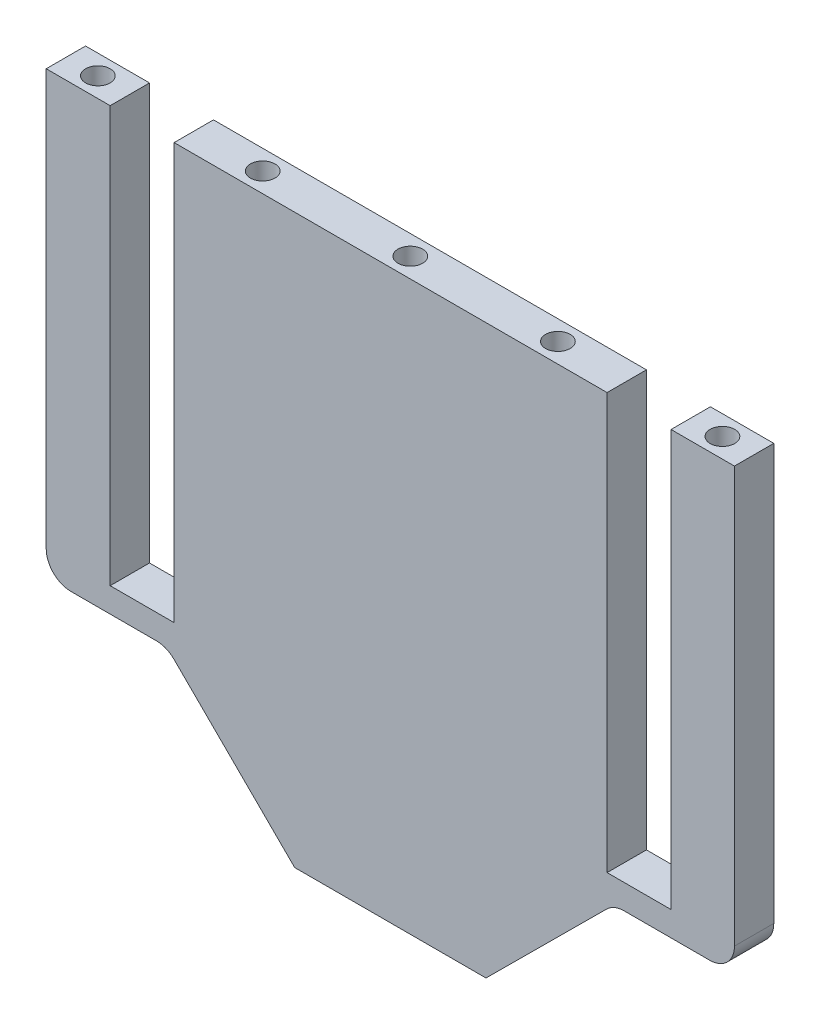
ISO-10303-21;
HEADER;
FILE_DESCRIPTION(('STEP AP214'),'2;1');
FILE_NAME('part.step','',(''),(''),'','','');
FILE_SCHEMA(('AUTOMOTIVE_DESIGN { 1 0 10303 214 1 1 1 1 }'));
ENDSEC;
DATA;
#1=APPLICATION_CONTEXT('core data for automotive mechanical design processes');
#2=APPLICATION_PROTOCOL_DEFINITION('international standard','automotive_design',2000,#1);
#3=PRODUCT_CONTEXT('',#1,'mechanical');
#4=PRODUCT('Part','Part','',(#3));
#5=PRODUCT_RELATED_PRODUCT_CATEGORY('part','',(#4));
#6=PRODUCT_DEFINITION_FORMATION('','',#4);
#7=PRODUCT_DEFINITION_CONTEXT('part definition',#1,'design');
#8=PRODUCT_DEFINITION('design','',#6,#7);
#9=PRODUCT_DEFINITION_SHAPE('','',#8);
#10=(LENGTH_UNIT() NAMED_UNIT(*) SI_UNIT(.MILLI.,.METRE.));
#11=(NAMED_UNIT(*) PLANE_ANGLE_UNIT() SI_UNIT($,.RADIAN.));
#12=(NAMED_UNIT(*) SI_UNIT($,.STERADIAN.) SOLID_ANGLE_UNIT());
#13=UNCERTAINTY_MEASURE_WITH_UNIT(LENGTH_MEASURE(1.E-05),#10,'distance_accuracy_value','');
#14=(GEOMETRIC_REPRESENTATION_CONTEXT(3) GLOBAL_UNCERTAINTY_ASSIGNED_CONTEXT((#13)) GLOBAL_UNIT_ASSIGNED_CONTEXT((#10,
#11,#12)) REPRESENTATION_CONTEXT('',''));
#15=CARTESIAN_POINT('',(0.,0.,0.));
#16=DIRECTION('',(0.,0.,1.));
#17=DIRECTION('',(1.,0.,0.));
#18=AXIS2_PLACEMENT_3D('',#15,#16,#17);
#19=CARTESIAN_POINT('',(0.,115.359943174136,8.01));
#20=DIRECTION('',(0.,1.,0.));
#21=DIRECTION('',(0.,0.,1.));
#22=AXIS2_PLACEMENT_3D('',#19,#20,#21);
#23=PLANE('',#22);
#24=CARTESIAN_POINT('',(6.49999999999998,115.359943174136,4.));
#25=DIRECTION('',(0.,-1.,0.));
#26=DIRECTION('',(0.,0.,-1.));
#27=AXIS2_PLACEMENT_3D('',#24,#25,#26);
#28=CIRCLE('',#27,2.5);
#29=CARTESIAN_POINT('',(6.49999999999998,115.359943174136,1.50000000000001));
#30=VERTEX_POINT('',#29);
#31=EDGE_CURVE('E387',#30,#30,#28,.T.);
#32=ORIENTED_EDGE('',*,*,#31,.T.);
#33=EDGE_LOOP('',(#32));
#34=FACE_BOUND('',#33,.T.);
#35=DIRECTION('',(0.,0.,1.));
#36=VECTOR('',#35,1.);
#37=CARTESIAN_POINT('',(0.,115.359943174136,8.));
#38=LINE('',#37,#36);
#39=CARTESIAN_POINT('',(0.,115.359943174136,0.));
#40=VERTEX_POINT('',#39);
#41=CARTESIAN_POINT('',(0.,115.359943174136,8.));
#42=VERTEX_POINT('',#41);
#43=EDGE_CURVE('E189',#40,#42,#38,.T.);
#44=ORIENTED_EDGE('',*,*,#43,.T.);
#45=DIRECTION('',(1.,0.,0.));
#46=VECTOR('',#45,1.);
#47=CARTESIAN_POINT('',(22.4368378443237,115.359943174136,8.));
#48=LINE('',#47,#46);
#49=CARTESIAN_POINT('',(13.,115.359943174136,8.));
#50=VERTEX_POINT('',#49);
#51=EDGE_CURVE('E192',#42,#50,#48,.T.);
#52=ORIENTED_EDGE('',*,*,#51,.T.);
#53=DIRECTION('',(0.,0.,1.));
#54=VECTOR('',#53,1.);
#55=CARTESIAN_POINT('',(13.,115.359943174136,8.));
#56=LINE('',#55,#54);
#57=CARTESIAN_POINT('',(13.,115.359943174136,0.));
#58=VERTEX_POINT('',#57);
#59=EDGE_CURVE('E190',#58,#50,#56,.T.);
#60=ORIENTED_EDGE('',*,*,#59,.F.);
#61=DIRECTION('',(1.,0.,0.));
#62=VECTOR('',#61,1.);
#63=CARTESIAN_POINT('',(22.4368378443237,115.359943174136,0.));
#64=LINE('',#63,#62);
#65=EDGE_CURVE('E176',#40,#58,#64,.T.);
#66=ORIENTED_EDGE('',*,*,#65,.F.);
#67=EDGE_LOOP('',(#44,#52,#60,#66));
#68=FACE_BOUND('',#67,.T.);
#69=ADVANCED_FACE('F40',(#34,#68),#23,.T.);
#70=CARTESIAN_POINT('',(133.441429644931,115.359943174136,4.));
#71=DIRECTION('',(0.,-1.,0.));
#72=DIRECTION('',(0.,0.,-1.));
#73=AXIS2_PLACEMENT_3D('',#70,#71,#72);
#74=CIRCLE('',#73,2.5);
#75=CARTESIAN_POINT('',(133.441429644931,115.359943174136,1.50000000000001));
#76=VERTEX_POINT('',#75);
#77=EDGE_CURVE('E205',#76,#76,#74,.T.);
#78=ORIENTED_EDGE('',*,*,#77,.T.);
#79=EDGE_LOOP('',(#78));
#80=FACE_BOUND('',#79,.T.);
#81=DIRECTION('',(0.,0.,-1.));
#82=VECTOR('',#81,1.);
#83=CARTESIAN_POINT('',(127.,115.359943174136,8.));
#84=LINE('',#83,#82);
#85=CARTESIAN_POINT('',(127.,115.359943174136,8.));
#86=VERTEX_POINT('',#85);
#87=CARTESIAN_POINT('',(127.,115.359943174136,0.));
#88=VERTEX_POINT('',#87);
#89=EDGE_CURVE('E245',#86,#88,#84,.T.);
#90=ORIENTED_EDGE('',*,*,#89,.F.);
#91=CARTESIAN_POINT('',(139.882859289862,115.359943174136,8.));
#92=VERTEX_POINT('',#91);
#93=EDGE_CURVE('E202',#86,#92,#48,.T.);
#94=ORIENTED_EDGE('',*,*,#93,.T.);
#95=DIRECTION('',(0.,0.,-1.));
#96=VECTOR('',#95,1.);
#97=CARTESIAN_POINT('',(139.882859289862,115.359943174136,8.));
#98=LINE('',#97,#96);
#99=CARTESIAN_POINT('',(139.882859289862,115.359943174136,0.));
#100=VERTEX_POINT('',#99);
#101=EDGE_CURVE('E198',#92,#100,#98,.T.);
#102=ORIENTED_EDGE('',*,*,#101,.T.);
#103=EDGE_CURVE('E194',#88,#100,#64,.T.);
#104=ORIENTED_EDGE('',*,*,#103,.F.);
#105=EDGE_LOOP('',(#90,#94,#102,#104));
#106=FACE_BOUND('',#105,.T.);
#107=ADVANCED_FACE('F299',(#80,#106),#23,.T.);
#108=CARTESIAN_POINT('',(70.,115.359943174136,4.));
#109=DIRECTION('',(0.,-1.,0.));
#110=DIRECTION('',(0.,0.,-1.));
#111=AXIS2_PLACEMENT_3D('',#108,#109,#110);
#112=CIRCLE('',#111,2.5);
#113=CARTESIAN_POINT('',(70.,115.359943174136,1.50000000000001));
#114=VERTEX_POINT('',#113);
#115=EDGE_CURVE('E405',#114,#114,#112,.T.);
#116=ORIENTED_EDGE('',*,*,#115,.T.);
#117=EDGE_LOOP('',(#116));
#118=FACE_BOUND('',#117,.T.);
#119=CARTESIAN_POINT('',(100.,115.359943174136,4.));
#120=DIRECTION('',(0.,-1.,0.));
#121=DIRECTION('',(0.,0.,-1.));
#122=AXIS2_PLACEMENT_3D('',#119,#120,#121);
#123=CIRCLE('',#122,2.5);
#124=CARTESIAN_POINT('',(100.,115.359943174136,1.50000000000001));
#125=VERTEX_POINT('',#124);
#126=EDGE_CURVE('E399',#125,#125,#123,.T.);
#127=ORIENTED_EDGE('',*,*,#126,.T.);
#128=EDGE_LOOP('',(#127));
#129=FACE_BOUND('',#128,.T.);
#130=CARTESIAN_POINT('',(40.,115.359943174136,4.));
#131=DIRECTION('',(0.,-1.,0.));
#132=DIRECTION('',(0.,0.,-1.));
#133=AXIS2_PLACEMENT_3D('',#130,#131,#132);
#134=CIRCLE('',#133,2.5);
#135=CARTESIAN_POINT('',(40.,115.359943174136,1.50000000000001));
#136=VERTEX_POINT('',#135);
#137=EDGE_CURVE('E393',#136,#136,#134,.T.);
#138=ORIENTED_EDGE('',*,*,#137,.T.);
#139=EDGE_LOOP('',(#138));
#140=FACE_BOUND('',#139,.T.);
#141=DIRECTION('',(0.,0.,-1.));
#142=VECTOR('',#141,1.);
#143=CARTESIAN_POINT('',(26.,115.359943174136,8.));
#144=LINE('',#143,#142);
#145=CARTESIAN_POINT('',(26.,115.359943174136,8.));
#146=VERTEX_POINT('',#145);
#147=CARTESIAN_POINT('',(26.,115.359943174136,0.));
#148=VERTEX_POINT('',#147);
#149=EDGE_CURVE('E248',#146,#148,#144,.T.);
#150=ORIENTED_EDGE('',*,*,#149,.F.);
#151=CARTESIAN_POINT('',(114.,115.359943174136,8.));
#152=VERTEX_POINT('',#151);
#153=EDGE_CURVE('E251',#146,#152,#48,.T.);
#154=ORIENTED_EDGE('',*,*,#153,.T.);
#155=DIRECTION('',(0.,0.,1.));
#156=VECTOR('',#155,1.);
#157=CARTESIAN_POINT('',(114.,115.359943174136,8.));
#158=LINE('',#157,#156);
#159=CARTESIAN_POINT('',(114.,115.359943174136,0.));
#160=VERTEX_POINT('',#159);
#161=EDGE_CURVE('E242',#160,#152,#158,.T.);
#162=ORIENTED_EDGE('',*,*,#161,.F.);
#163=EDGE_CURVE('E191',#148,#160,#64,.T.);
#164=ORIENTED_EDGE('',*,*,#163,.F.);
#165=EDGE_LOOP('',(#150,#154,#162,#164));
#166=FACE_BOUND('',#165,.T.);
#167=ADVANCED_FACE('F430',(#118,#129,#140,#166),#23,.T.);
#168=CARTESIAN_POINT('',(5.00000000000006,25.8599431741363,8.));
#169=DIRECTION('',(0.,1.,0.));
#170=DIRECTION('',(0.,0.,1.));
#171=AXIS2_PLACEMENT_3D('',#168,#169,#170);
#172=PLANE('',#171);
#173=DIRECTION('',(1.,0.,0.));
#174=VECTOR('',#173,1.);
#175=CARTESIAN_POINT('',(5.00000000000006,25.8599431741363,0.));
#176=LINE('',#175,#174);
#177=CARTESIAN_POINT('',(5.00000000000006,25.8599431741363,0.));
#178=VERTEX_POINT('',#177);
#179=CARTESIAN_POINT('',(22.4368378443237,25.8599431741363,0.));
#180=VERTEX_POINT('',#179);
#181=EDGE_CURVE('E343',#178,#180,#176,.T.);
#182=ORIENTED_EDGE('',*,*,#181,.T.);
#183=DIRECTION('',(0.,0.,-1.));
#184=VECTOR('',#183,1.);
#185=CARTESIAN_POINT('',(22.4368378443237,25.8599431741363,8.));
#186=LINE('',#185,#184);
#187=CARTESIAN_POINT('',(22.4368378443237,25.8599431741363,8.));
#188=VERTEX_POINT('',#187);
#189=EDGE_CURVE('E359',#188,#180,#186,.T.);
#190=ORIENTED_EDGE('',*,*,#189,.F.);
#191=DIRECTION('',(1.,0.,0.));
#192=VECTOR('',#191,1.);
#193=CARTESIAN_POINT('',(5.00000000000006,25.8599431741363,8.));
#194=LINE('',#193,#192);
#195=CARTESIAN_POINT('',(5.00000000000006,25.8599431741363,8.));
#196=VERTEX_POINT('',#195);
#197=EDGE_CURVE('E322',#196,#188,#194,.T.);
#198=ORIENTED_EDGE('',*,*,#197,.F.);
#199=DIRECTION('',(0.,0.,-1.));
#200=VECTOR('',#199,1.);
#201=CARTESIAN_POINT('',(5.00000000000006,25.8599431741363,8.));
#202=LINE('',#201,#200);
#203=EDGE_CURVE('E355',#196,#178,#202,.T.);
#204=ORIENTED_EDGE('',*,*,#203,.T.);
#205=EDGE_LOOP('',(#182,#190,#198,#204));
#206=FACE_BOUND('',#205,.T.);
#207=ADVANCED_FACE('F358',(#206),#172,.F.);
#208=CARTESIAN_POINT('',(22.4368378443237,20.8599431741363,8.));
#209=DIRECTION('',(0.,0.,-1.));
#210=DIRECTION('',(-1.,0.,0.));
#211=AXIS2_PLACEMENT_3D('',#208,#209,#210);
#212=CYLINDRICAL_SURFACE('',#211,5.);
#213=CARTESIAN_POINT('',(22.4368378443237,20.8599431741363,0.));
#214=DIRECTION('',(0.,0.,-1.));
#215=DIRECTION('',(-1.,0.,0.));
#216=AXIS2_PLACEMENT_3D('',#213,#214,#215);
#217=CIRCLE('',#216,5.);
#218=CARTESIAN_POINT('',(25.9628105654398,24.4050124781055,0.));
#219=VERTEX_POINT('',#218);
#220=EDGE_CURVE('E336',#180,#219,#217,.T.);
#221=ORIENTED_EDGE('',*,*,#220,.T.);
#222=DIRECTION('',(0.,0.,-1.));
#223=VECTOR('',#222,1.);
#224=CARTESIAN_POINT('',(25.9628105654398,24.4050124781055,8.));
#225=LINE('',#224,#223);
#226=CARTESIAN_POINT('',(25.9628105654398,24.4050124781055,8.));
#227=VERTEX_POINT('',#226);
#228=EDGE_CURVE('E367',#227,#219,#225,.T.);
#229=ORIENTED_EDGE('',*,*,#228,.F.);
#230=CARTESIAN_POINT('',(22.4368378443237,20.8599431741363,8.));
#231=DIRECTION('',(0.,0.,-1.));
#232=DIRECTION('',(-1.,0.,0.));
#233=AXIS2_PLACEMENT_3D('',#230,#231,#232);
#234=CIRCLE('',#233,5.);
#235=EDGE_CURVE('E319',#188,#227,#234,.T.);
#236=ORIENTED_EDGE('',*,*,#235,.F.);
#237=ORIENTED_EDGE('',*,*,#189,.T.);
#238=EDGE_LOOP('',(#221,#229,#236,#237));
#239=FACE_BOUND('',#238,.T.);
#240=ADVANCED_FACE('F365',(#239),#212,.F.);
#241=CARTESIAN_POINT('',(25.9628105654398,24.4050124781055,8.));
#242=DIRECTION('',(0.705194544223226,0.709013860793847,0.));
#243=DIRECTION('',(-0.709013860793847,0.705194544223226,0.));
#244=AXIS2_PLACEMENT_3D('',#241,#242,#243);
#245=PLANE('',#244);
#246=DIRECTION('',(0.709013860793847,-0.705194544223226,0.));
#247=VECTOR('',#246,1.);
#248=CARTESIAN_POINT('',(25.9628105654398,24.4050124781055,0.));
#249=LINE('',#248,#247);
#250=CARTESIAN_POINT('',(50.5,0.,0.));
#251=VERTEX_POINT('',#250);
#252=EDGE_CURVE('E333',#219,#251,#249,.T.);
#253=ORIENTED_EDGE('',*,*,#252,.T.);
#254=DIRECTION('',(0.,0.,-1.));
#255=VECTOR('',#254,1.);
#256=CARTESIAN_POINT('',(50.5,0.,8.));
#257=LINE('',#256,#255);
#258=CARTESIAN_POINT('',(50.5,0.,8.));
#259=VERTEX_POINT('',#258);
#260=EDGE_CURVE('E320',#259,#251,#257,.T.);
#261=ORIENTED_EDGE('',*,*,#260,.F.);
#262=DIRECTION('',(0.709013860793847,-0.705194544223226,0.));
#263=VECTOR('',#262,1.);
#264=CARTESIAN_POINT('',(25.9628105654398,24.4050124781055,8.));
#265=LINE('',#264,#263);
#266=EDGE_CURVE('E317',#227,#259,#265,.T.);
#267=ORIENTED_EDGE('',*,*,#266,.F.);
#268=ORIENTED_EDGE('',*,*,#228,.T.);
#269=EDGE_LOOP('',(#253,#261,#267,#268));
#270=FACE_BOUND('',#269,.T.);
#271=ADVANCED_FACE('F369',(#270),#245,.F.);
#272=CARTESIAN_POINT('',(89.3828592898621,0.,8.));
#273=DIRECTION('',(0.,1.,0.));
#274=DIRECTION('',(0.,0.,1.));
#275=AXIS2_PLACEMENT_3D('',#272,#273,#274);
#276=PLANE('',#275);
#277=DIRECTION('',(1.,0.,0.));
#278=VECTOR('',#277,1.);
#279=CARTESIAN_POINT('',(89.3828592898621,0.,0.));
#280=LINE('',#279,#278);
#281=CARTESIAN_POINT('',(89.3828592898621,0.,0.));
#282=VERTEX_POINT('',#281);
#283=EDGE_CURVE('E273',#251,#282,#280,.T.);
#284=ORIENTED_EDGE('',*,*,#283,.T.);
#285=DIRECTION('',(0.,0.,-1.));
#286=VECTOR('',#285,1.);
#287=CARTESIAN_POINT('',(89.3828592898621,0.,8.));
#288=LINE('',#287,#286);
#289=CARTESIAN_POINT('',(89.3828592898621,0.,8.));
#290=VERTEX_POINT('',#289);
#291=EDGE_CURVE('E244',#290,#282,#288,.T.);
#292=ORIENTED_EDGE('',*,*,#291,.F.);
#293=DIRECTION('',(1.,0.,0.));
#294=VECTOR('',#293,1.);
#295=CARTESIAN_POINT('',(89.3828592898621,0.,8.));
#296=LINE('',#295,#294);
#297=EDGE_CURVE('E331',#259,#290,#296,.T.);
#298=ORIENTED_EDGE('',*,*,#297,.F.);
#299=ORIENTED_EDGE('',*,*,#260,.T.);
#300=EDGE_LOOP('',(#284,#292,#298,#299));
#301=FACE_BOUND('',#300,.T.);
#302=ADVANCED_FACE('F444',(#301),#276,.F.);
#303=CARTESIAN_POINT('',(113.920048724422,24.4050124781055,8.));
#304=DIRECTION('',(-0.705194544223226,0.709013860793847,0.));
#305=DIRECTION('',(-0.709013860793847,-0.705194544223226,0.));
#306=AXIS2_PLACEMENT_3D('',#303,#304,#305);
#307=PLANE('',#306);
#308=DIRECTION('',(0.709013860793847,0.705194544223226,0.));
#309=VECTOR('',#308,1.);
#310=CARTESIAN_POINT('',(113.920048724422,24.4050124781055,0.));
#311=LINE('',#310,#309);
#312=CARTESIAN_POINT('',(113.920048724422,24.4050124781055,0.));
#313=VERTEX_POINT('',#312);
#314=EDGE_CURVE('E313',#282,#313,#311,.T.);
#315=ORIENTED_EDGE('',*,*,#314,.T.);
#316=DIRECTION('',(0.,0.,-1.));
#317=VECTOR('',#316,1.);
#318=CARTESIAN_POINT('',(113.920048724422,24.4050124781055,8.));
#319=LINE('',#318,#317);
#320=CARTESIAN_POINT('',(113.920048724422,24.4050124781055,8.));
#321=VERTEX_POINT('',#320);
#322=EDGE_CURVE('E379',#321,#313,#319,.T.);
#323=ORIENTED_EDGE('',*,*,#322,.F.);
#324=DIRECTION('',(0.709013860793847,0.705194544223226,0.));
#325=VECTOR('',#324,1.);
#326=CARTESIAN_POINT('',(113.920048724422,24.4050124781055,8.));
#327=LINE('',#326,#325);
#328=EDGE_CURVE('E330',#290,#321,#327,.T.);
#329=ORIENTED_EDGE('',*,*,#328,.F.);
#330=ORIENTED_EDGE('',*,*,#291,.T.);
#331=EDGE_LOOP('',(#315,#323,#329,#330));
#332=FACE_BOUND('',#331,.T.);
#333=ADVANCED_FACE('F516',(#332),#307,.F.);
#334=CARTESIAN_POINT('',(117.446021445538,20.8599431741363,8.));
#335=DIRECTION('',(0.,0.,-1.));
#336=DIRECTION('',(-1.,0.,0.));
#337=AXIS2_PLACEMENT_3D('',#334,#335,#336);
#338=CYLINDRICAL_SURFACE('',#337,5.);
#339=CARTESIAN_POINT('',(117.446021445538,20.8599431741363,0.));
#340=DIRECTION('',(0.,0.,-1.));
#341=DIRECTION('',(1.,0.,0.));
#342=AXIS2_PLACEMENT_3D('',#339,#340,#341);
#343=CIRCLE('',#342,5.);
#344=CARTESIAN_POINT('',(117.446021445538,25.8599431741363,0.));
#345=VERTEX_POINT('',#344);
#346=EDGE_CURVE('E307',#313,#345,#343,.T.);
#347=ORIENTED_EDGE('',*,*,#346,.T.);
#348=DIRECTION('',(0.,0.,-1.));
#349=VECTOR('',#348,1.);
#350=CARTESIAN_POINT('',(117.446021445538,25.8599431741363,8.));
#351=LINE('',#350,#349);
#352=CARTESIAN_POINT('',(117.446021445538,25.8599431741363,8.));
#353=VERTEX_POINT('',#352);
#354=EDGE_CURVE('E376',#353,#345,#351,.T.);
#355=ORIENTED_EDGE('',*,*,#354,.F.);
#356=CARTESIAN_POINT('',(117.446021445538,20.8599431741363,8.));
#357=DIRECTION('',(0.,0.,-1.));
#358=DIRECTION('',(1.,0.,0.));
#359=AXIS2_PLACEMENT_3D('',#356,#357,#358);
#360=CIRCLE('',#359,5.);
#361=EDGE_CURVE('E328',#321,#353,#360,.T.);
#362=ORIENTED_EDGE('',*,*,#361,.F.);
#363=ORIENTED_EDGE('',*,*,#322,.T.);
#364=EDGE_LOOP('',(#347,#355,#362,#363));
#365=FACE_BOUND('',#364,.T.);
#366=ADVANCED_FACE('F508',(#365),#338,.F.);
#367=CARTESIAN_POINT('',(134.882859289862,25.8599431741363,8.));
#368=DIRECTION('',(0.,1.,0.));
#369=DIRECTION('',(0.,0.,1.));
#370=AXIS2_PLACEMENT_3D('',#367,#368,#369);
#371=PLANE('',#370);
#372=DIRECTION('',(1.,0.,0.));
#373=VECTOR('',#372,1.);
#374=CARTESIAN_POINT('',(134.882859289862,25.8599431741363,0.));
#375=LINE('',#374,#373);
#376=CARTESIAN_POINT('',(134.882859289862,25.8599431741363,0.));
#377=VERTEX_POINT('',#376);
#378=EDGE_CURVE('E303',#345,#377,#375,.T.);
#379=ORIENTED_EDGE('',*,*,#378,.T.);
#380=DIRECTION('',(0.,0.,-1.));
#381=VECTOR('',#380,1.);
#382=CARTESIAN_POINT('',(134.882859289862,25.8599431741363,8.));
#383=LINE('',#382,#381);
#384=CARTESIAN_POINT('',(134.882859289862,25.8599431741363,8.));
#385=VERTEX_POINT('',#384);
#386=EDGE_CURVE('E374',#385,#377,#383,.T.);
#387=ORIENTED_EDGE('',*,*,#386,.F.);
#388=DIRECTION('',(1.,0.,0.));
#389=VECTOR('',#388,1.);
#390=CARTESIAN_POINT('',(134.882859289862,25.8599431741363,8.));
#391=LINE('',#390,#389);
#392=EDGE_CURVE('E326',#353,#385,#391,.T.);
#393=ORIENTED_EDGE('',*,*,#392,.F.);
#394=ORIENTED_EDGE('',*,*,#354,.T.);
#395=EDGE_LOOP('',(#379,#387,#393,#394));
#396=FACE_BOUND('',#395,.T.);
#397=ADVANCED_FACE('F502',(#396),#371,.F.);
#398=CARTESIAN_POINT('',(134.882859289862,30.8599431741363,8.));
#399=DIRECTION('',(0.,0.,-1.));
#400=DIRECTION('',(-1.,0.,0.));
#401=AXIS2_PLACEMENT_3D('',#398,#399,#400);
#402=CYLINDRICAL_SURFACE('',#401,5.);
#403=CARTESIAN_POINT('',(134.882859289862,30.8599431741363,0.));
#404=DIRECTION('',(0.,0.,1.));
#405=DIRECTION('',(1.,0.,0.));
#406=AXIS2_PLACEMENT_3D('',#403,#404,#405);
#407=CIRCLE('',#406,5.);
#408=CARTESIAN_POINT('',(139.882859289862,30.8599431741363,0.));
#409=VERTEX_POINT('',#408);
#410=EDGE_CURVE('E215',#377,#409,#407,.T.);
#411=ORIENTED_EDGE('',*,*,#410,.T.);
#412=DIRECTION('',(0.,0.,-1.));
#413=VECTOR('',#412,1.);
#414=CARTESIAN_POINT('',(139.882859289862,30.8599431741363,8.));
#415=LINE('',#414,#413);
#416=CARTESIAN_POINT('',(139.882859289862,30.8599431741363,8.));
#417=VERTEX_POINT('',#416);
#418=EDGE_CURVE('E296',#417,#409,#415,.T.);
#419=ORIENTED_EDGE('',*,*,#418,.F.);
#420=CARTESIAN_POINT('',(134.882859289862,30.8599431741363,8.));
#421=DIRECTION('',(0.,0.,1.));
#422=DIRECTION('',(1.,0.,0.));
#423=AXIS2_PLACEMENT_3D('',#420,#421,#422);
#424=CIRCLE('',#423,5.);
#425=EDGE_CURVE('E212',#385,#417,#424,.T.);
#426=ORIENTED_EDGE('',*,*,#425,.F.);
#427=ORIENTED_EDGE('',*,*,#386,.T.);
#428=EDGE_LOOP('',(#411,#419,#426,#427));
#429=FACE_BOUND('',#428,.T.);
#430=ADVANCED_FACE('F496',(#429),#402,.T.);
#431=CARTESIAN_POINT('',(5.00000000000002,30.8599431741363,8.));
#432=DIRECTION('',(0.,0.,-1.));
#433=DIRECTION('',(-1.,0.,0.));
#434=AXIS2_PLACEMENT_3D('',#431,#432,#433);
#435=CYLINDRICAL_SURFACE('',#434,5.);
#436=CARTESIAN_POINT('',(5.00000000000002,30.8599431741363,0.));
#437=DIRECTION('',(0.,0.,1.));
#438=DIRECTION('',(-1.,0.,0.));
#439=AXIS2_PLACEMENT_3D('',#436,#437,#438);
#440=CIRCLE('',#439,5.);
#441=CARTESIAN_POINT('',(0.,30.8599431741363,0.));
#442=VERTEX_POINT('',#441);
#443=EDGE_CURVE('E179',#442,#178,#440,.T.);
#444=ORIENTED_EDGE('',*,*,#443,.T.);
#445=ORIENTED_EDGE('',*,*,#203,.F.);
#446=CARTESIAN_POINT('',(5.00000000000002,30.8599431741363,8.));
#447=DIRECTION('',(0.,0.,1.));
#448=DIRECTION('',(-1.,0.,0.));
#449=AXIS2_PLACEMENT_3D('',#446,#447,#448);
#450=CIRCLE('',#449,5.);
#451=CARTESIAN_POINT('',(0.,30.8599431741363,8.));
#452=VERTEX_POINT('',#451);
#453=EDGE_CURVE('E211',#452,#196,#450,.T.);
#454=ORIENTED_EDGE('',*,*,#453,.F.);
#455=DIRECTION('',(0.,0.,-1.));
#456=VECTOR('',#455,1.);
#457=CARTESIAN_POINT('',(0.,30.8599431741363,8.));
#458=LINE('',#457,#456);
#459=EDGE_CURVE('E357',#452,#442,#458,.T.);
#460=ORIENTED_EDGE('',*,*,#459,.T.);
#461=EDGE_LOOP('',(#444,#445,#454,#460));
#462=FACE_BOUND('',#461,.T.);
#463=ADVANCED_FACE('F353',(#462),#435,.T.);
#464=CARTESIAN_POINT('',(13.,30.8599431741363,8.));
#465=DIRECTION('',(0.,1.,0.));
#466=DIRECTION('',(0.,0.,1.));
#467=AXIS2_PLACEMENT_3D('',#464,#465,#466);
#468=PLANE('',#467);
#469=DIRECTION('',(1.,0.,0.));
#470=VECTOR('',#469,1.);
#471=CARTESIAN_POINT('',(13.,30.8599431741363,0.));
#472=LINE('',#471,#470);
#473=CARTESIAN_POINT('',(13.,30.8599431741363,0.));
#474=VERTEX_POINT('',#473);
#475=CARTESIAN_POINT('',(26.,30.8599431741363,0.));
#476=VERTEX_POINT('',#475);
#477=EDGE_CURVE('E228',#474,#476,#472,.T.);
#478=ORIENTED_EDGE('',*,*,#477,.F.);
#479=DIRECTION('',(0.,0.,-1.));
#480=VECTOR('',#479,1.);
#481=CARTESIAN_POINT('',(13.,30.8599431741363,8.));
#482=LINE('',#481,#480);
#483=CARTESIAN_POINT('',(13.,30.8599431741363,8.));
#484=VERTEX_POINT('',#483);
#485=EDGE_CURVE('E219',#484,#474,#482,.T.);
#486=ORIENTED_EDGE('',*,*,#485,.F.);
#487=DIRECTION('',(1.,0.,0.));
#488=VECTOR('',#487,1.);
#489=CARTESIAN_POINT('',(13.,30.8599431741363,8.));
#490=LINE('',#489,#488);
#491=CARTESIAN_POINT('',(26.,30.8599431741363,8.));
#492=VERTEX_POINT('',#491);
#493=EDGE_CURVE('E222',#484,#492,#490,.T.);
#494=ORIENTED_EDGE('',*,*,#493,.T.);
#495=DIRECTION('',(0.,0.,-1.));
#496=VECTOR('',#495,1.);
#497=CARTESIAN_POINT('',(26.,30.8599431741363,8.));
#498=LINE('',#497,#496);
#499=EDGE_CURVE('E271',#492,#476,#498,.T.);
#500=ORIENTED_EDGE('',*,*,#499,.T.);
#501=EDGE_LOOP('',(#478,#486,#494,#500));
#502=FACE_BOUND('',#501,.T.);
#503=ADVANCED_FACE('F267',(#502),#468,.T.);
#504=CARTESIAN_POINT('',(127.,30.8599431741363,8.));
#505=DIRECTION('',(0.,1.,0.));
#506=DIRECTION('',(0.,0.,1.));
#507=AXIS2_PLACEMENT_3D('',#504,#505,#506);
#508=PLANE('',#507);
#509=DIRECTION('',(1.,0.,0.));
#510=VECTOR('',#509,1.);
#511=CARTESIAN_POINT('',(127.,30.8599431741363,0.));
#512=LINE('',#511,#510);
#513=CARTESIAN_POINT('',(114.,30.8599431741363,0.));
#514=VERTEX_POINT('',#513);
#515=CARTESIAN_POINT('',(127.,30.8599431741363,0.));
#516=VERTEX_POINT('',#515);
#517=EDGE_CURVE('E234',#514,#516,#512,.T.);
#518=ORIENTED_EDGE('',*,*,#517,.F.);
#519=DIRECTION('',(0.,0.,-1.));
#520=VECTOR('',#519,1.);
#521=CARTESIAN_POINT('',(114.,30.8599431741363,8.));
#522=LINE('',#521,#520);
#523=CARTESIAN_POINT('',(114.,30.8599431741363,8.));
#524=VERTEX_POINT('',#523);
#525=EDGE_CURVE('E278',#524,#514,#522,.T.);
#526=ORIENTED_EDGE('',*,*,#525,.F.);
#527=DIRECTION('',(1.,0.,0.));
#528=VECTOR('',#527,1.);
#529=CARTESIAN_POINT('',(127.,30.8599431741363,8.));
#530=LINE('',#529,#528);
#531=CARTESIAN_POINT('',(127.,30.8599431741363,8.));
#532=VERTEX_POINT('',#531);
#533=EDGE_CURVE('E232',#524,#532,#530,.T.);
#534=ORIENTED_EDGE('',*,*,#533,.T.);
#535=DIRECTION('',(0.,0.,-1.));
#536=VECTOR('',#535,1.);
#537=CARTESIAN_POINT('',(127.,30.8599431741363,8.));
#538=LINE('',#537,#536);
#539=EDGE_CURVE('E239',#532,#516,#538,.T.);
#540=ORIENTED_EDGE('',*,*,#539,.T.);
#541=EDGE_LOOP('',(#518,#526,#534,#540));
#542=FACE_BOUND('',#541,.T.);
#543=ADVANCED_FACE('F284',(#542),#508,.T.);
#544=CARTESIAN_POINT('',(22.4368378443237,20.8599431741363,8.));
#545=DIRECTION('',(0.,0.,-1.));
#546=DIRECTION('',(-1.,0.,0.));
#547=AXIS2_PLACEMENT_3D('',#544,#545,#546);
#548=PLANE('',#547);
#549=ORIENTED_EDGE('',*,*,#51,.F.);
#550=DIRECTION('',(0.,-1.,0.));
#551=VECTOR('',#550,1.);
#552=CARTESIAN_POINT('',(0.,30.8599431741363,8.));
#553=LINE('',#552,#551);
#554=EDGE_CURVE('E196',#42,#452,#553,.T.);
#555=ORIENTED_EDGE('',*,*,#554,.T.);
#556=ORIENTED_EDGE('',*,*,#453,.T.);
#557=ORIENTED_EDGE('',*,*,#197,.T.);
#558=ORIENTED_EDGE('',*,*,#235,.T.);
#559=ORIENTED_EDGE('',*,*,#266,.T.);
#560=ORIENTED_EDGE('',*,*,#297,.T.);
#561=ORIENTED_EDGE('',*,*,#328,.T.);
#562=ORIENTED_EDGE('',*,*,#361,.T.);
#563=ORIENTED_EDGE('',*,*,#392,.T.);
#564=ORIENTED_EDGE('',*,*,#425,.T.);
#565=DIRECTION('',(0.,1.,0.));
#566=VECTOR('',#565,1.);
#567=CARTESIAN_POINT('',(139.882859289862,30.8599431741363,8.));
#568=LINE('',#567,#566);
#569=EDGE_CURVE('E210',#417,#92,#568,.T.);
#570=ORIENTED_EDGE('',*,*,#569,.T.);
#571=ORIENTED_EDGE('',*,*,#93,.F.);
#572=DIRECTION('',(0.,1.,0.));
#573=VECTOR('',#572,1.);
#574=CARTESIAN_POINT('',(127.,219.008918922933,8.));
#575=LINE('',#574,#573);
#576=EDGE_CURVE('E231',#532,#86,#575,.T.);
#577=ORIENTED_EDGE('',*,*,#576,.F.);
#578=ORIENTED_EDGE('',*,*,#533,.F.);
#579=DIRECTION('',(0.,-1.,0.));
#580=VECTOR('',#579,1.);
#581=CARTESIAN_POINT('',(114.,30.8599431741363,8.));
#582=LINE('',#581,#580);
#583=EDGE_CURVE('E229',#152,#524,#582,.T.);
#584=ORIENTED_EDGE('',*,*,#583,.F.);
#585=ORIENTED_EDGE('',*,*,#153,.F.);
#586=DIRECTION('',(0.,1.,0.));
#587=VECTOR('',#586,1.);
#588=CARTESIAN_POINT('',(26.,30.8599431741363,8.));
#589=LINE('',#588,#587);
#590=EDGE_CURVE('E218',#492,#146,#589,.T.);
#591=ORIENTED_EDGE('',*,*,#590,.F.);
#592=ORIENTED_EDGE('',*,*,#493,.F.);
#593=DIRECTION('',(0.,-1.,0.));
#594=VECTOR('',#593,1.);
#595=CARTESIAN_POINT('',(13.,219.008918922933,8.));
#596=LINE('',#595,#594);
#597=EDGE_CURVE('E216',#50,#484,#596,.T.);
#598=ORIENTED_EDGE('',*,*,#597,.F.);
#599=EDGE_LOOP('',(#549,#555,#556,#557,#558,#559,#560,#561,#562,#563,#564,#570,#571,#577,#578,
#584,#585,#591,#592,#598));
#600=FACE_BOUND('',#599,.T.);
#601=ADVANCED_FACE('F259',(#600),#548,.F.);
#602=CARTESIAN_POINT('',(22.4368378443237,20.8599431741363,0.));
#603=DIRECTION('',(0.,0.,-1.));
#604=DIRECTION('',(-1.,0.,0.));
#605=AXIS2_PLACEMENT_3D('',#602,#603,#604);
#606=PLANE('',#605);
#607=DIRECTION('',(0.,-1.,0.));
#608=VECTOR('',#607,1.);
#609=CARTESIAN_POINT('',(0.,30.8599431741363,0.));
#610=LINE('',#609,#608);
#611=EDGE_CURVE('E173',#40,#442,#610,.T.);
#612=ORIENTED_EDGE('',*,*,#611,.F.);
#613=ORIENTED_EDGE('',*,*,#65,.T.);
#614=DIRECTION('',(0.,-1.,0.));
#615=VECTOR('',#614,1.);
#616=CARTESIAN_POINT('',(13.,219.008918922933,0.));
#617=LINE('',#616,#615);
#618=EDGE_CURVE('E223',#58,#474,#617,.T.);
#619=ORIENTED_EDGE('',*,*,#618,.T.);
#620=ORIENTED_EDGE('',*,*,#477,.T.);
#621=DIRECTION('',(0.,1.,0.));
#622=VECTOR('',#621,1.);
#623=CARTESIAN_POINT('',(26.,30.8599431741363,0.));
#624=LINE('',#623,#622);
#625=EDGE_CURVE('E225',#476,#148,#624,.T.);
#626=ORIENTED_EDGE('',*,*,#625,.T.);
#627=ORIENTED_EDGE('',*,*,#163,.T.);
#628=DIRECTION('',(0.,-1.,0.));
#629=VECTOR('',#628,1.);
#630=CARTESIAN_POINT('',(114.,30.8599431741363,0.));
#631=LINE('',#630,#629);
#632=EDGE_CURVE('E49',#160,#514,#631,.T.);
#633=ORIENTED_EDGE('',*,*,#632,.T.);
#634=ORIENTED_EDGE('',*,*,#517,.T.);
#635=DIRECTION('',(0.,1.,0.));
#636=VECTOR('',#635,1.);
#637=CARTESIAN_POINT('',(127.,219.008918922933,0.));
#638=LINE('',#637,#636);
#639=EDGE_CURVE('E11',#516,#88,#638,.T.);
#640=ORIENTED_EDGE('',*,*,#639,.T.);
#641=ORIENTED_EDGE('',*,*,#103,.T.);
#642=DIRECTION('',(0.,1.,0.));
#643=VECTOR('',#642,1.);
#644=CARTESIAN_POINT('',(139.882859289862,30.8599431741363,0.));
#645=LINE('',#644,#643);
#646=EDGE_CURVE('E184',#409,#100,#645,.T.);
#647=ORIENTED_EDGE('',*,*,#646,.F.);
#648=ORIENTED_EDGE('',*,*,#410,.F.);
#649=ORIENTED_EDGE('',*,*,#378,.F.);
#650=ORIENTED_EDGE('',*,*,#346,.F.);
#651=ORIENTED_EDGE('',*,*,#314,.F.);
#652=ORIENTED_EDGE('',*,*,#283,.F.);
#653=ORIENTED_EDGE('',*,*,#252,.F.);
#654=ORIENTED_EDGE('',*,*,#220,.F.);
#655=ORIENTED_EDGE('',*,*,#181,.F.);
#656=ORIENTED_EDGE('',*,*,#443,.F.);
#657=EDGE_LOOP('',(#612,#613,#619,#620,#626,#627,#633,#634,#640,#641,#647,#648,#649,#650,#651,
#652,#653,#654,#655,#656));
#658=FACE_BOUND('',#657,.T.);
#659=ADVANCED_FACE('F175',(#658),#606,.T.);
#660=CARTESIAN_POINT('',(114.,30.8599431741363,8.));
#661=DIRECTION('',(1.,0.,0.));
#662=DIRECTION('',(0.,0.,-1.));
#663=AXIS2_PLACEMENT_3D('',#660,#661,#662);
#664=PLANE('',#663);
#665=ORIENTED_EDGE('',*,*,#632,.F.);
#666=ORIENTED_EDGE('',*,*,#161,.T.);
#667=ORIENTED_EDGE('',*,*,#583,.T.);
#668=ORIENTED_EDGE('',*,*,#525,.T.);
#669=EDGE_LOOP('',(#665,#666,#667,#668));
#670=FACE_BOUND('',#669,.T.);
#671=ADVANCED_FACE('F42',(#670),#664,.T.);
#672=CARTESIAN_POINT('',(127.,219.008918922933,8.));
#673=DIRECTION('',(-1.,0.,0.));
#674=DIRECTION('',(0.,0.,1.));
#675=AXIS2_PLACEMENT_3D('',#672,#673,#674);
#676=PLANE('',#675);
#677=ORIENTED_EDGE('',*,*,#576,.T.);
#678=ORIENTED_EDGE('',*,*,#89,.T.);
#679=ORIENTED_EDGE('',*,*,#639,.F.);
#680=ORIENTED_EDGE('',*,*,#539,.F.);
#681=EDGE_LOOP('',(#677,#678,#679,#680));
#682=FACE_BOUND('',#681,.T.);
#683=ADVANCED_FACE('F288',(#682),#676,.T.);
#684=CARTESIAN_POINT('',(13.,219.008918922933,8.));
#685=DIRECTION('',(1.,0.,0.));
#686=DIRECTION('',(0.,0.,-1.));
#687=AXIS2_PLACEMENT_3D('',#684,#685,#686);
#688=PLANE('',#687);
#689=ORIENTED_EDGE('',*,*,#618,.F.);
#690=ORIENTED_EDGE('',*,*,#59,.T.);
#691=ORIENTED_EDGE('',*,*,#597,.T.);
#692=ORIENTED_EDGE('',*,*,#485,.T.);
#693=EDGE_LOOP('',(#689,#690,#691,#692));
#694=FACE_BOUND('',#693,.T.);
#695=ADVANCED_FACE('F264',(#694),#688,.T.);
#696=CARTESIAN_POINT('',(26.,30.8599431741363,8.));
#697=DIRECTION('',(-1.,0.,0.));
#698=DIRECTION('',(0.,0.,1.));
#699=AXIS2_PLACEMENT_3D('',#696,#697,#698);
#700=PLANE('',#699);
#701=ORIENTED_EDGE('',*,*,#590,.T.);
#702=ORIENTED_EDGE('',*,*,#149,.T.);
#703=ORIENTED_EDGE('',*,*,#625,.F.);
#704=ORIENTED_EDGE('',*,*,#499,.F.);
#705=EDGE_LOOP('',(#701,#702,#703,#704));
#706=FACE_BOUND('',#705,.T.);
#707=ADVANCED_FACE('F460',(#706),#700,.T.);
#708=CARTESIAN_POINT('',(0.,30.8599431741363,8.));
#709=DIRECTION('',(1.,0.,0.));
#710=DIRECTION('',(0.,1.,0.));
#711=AXIS2_PLACEMENT_3D('',#708,#709,#710);
#712=PLANE('',#711);
#713=ORIENTED_EDGE('',*,*,#43,.F.);
#714=ORIENTED_EDGE('',*,*,#611,.T.);
#715=ORIENTED_EDGE('',*,*,#459,.F.);
#716=ORIENTED_EDGE('',*,*,#554,.F.);
#717=EDGE_LOOP('',(#713,#714,#715,#716));
#718=FACE_BOUND('',#717,.T.);
#719=ADVANCED_FACE('F195',(#718),#712,.F.);
#720=CARTESIAN_POINT('',(139.882859289862,30.8599431741363,8.));
#721=DIRECTION('',(-1.,0.,0.));
#722=DIRECTION('',(0.,0.,1.));
#723=AXIS2_PLACEMENT_3D('',#720,#721,#722);
#724=PLANE('',#723);
#725=ORIENTED_EDGE('',*,*,#101,.F.);
#726=ORIENTED_EDGE('',*,*,#569,.F.);
#727=ORIENTED_EDGE('',*,*,#418,.T.);
#728=ORIENTED_EDGE('',*,*,#646,.T.);
#729=EDGE_LOOP('',(#725,#726,#727,#728));
#730=FACE_BOUND('',#729,.T.);
#731=ADVANCED_FACE('F295',(#730),#724,.F.);
#732=CARTESIAN_POINT('',(40.,110.159943174136,4.));
#733=DIRECTION('',(0.,1.,0.));
#734=DIRECTION('',(0.,0.,1.));
#735=AXIS2_PLACEMENT_3D('',#732,#733,#734);
#736=CYLINDRICAL_SURFACE('',#735,2.5);
#737=CARTESIAN_POINT('',(40.,110.159943174136,4.));
#738=DIRECTION('',(0.,-1.,0.));
#739=DIRECTION('',(0.,0.,-1.));
#740=AXIS2_PLACEMENT_3D('',#737,#738,#739);
#741=CIRCLE('',#740,2.5);
#742=CARTESIAN_POINT('',(40.,110.159943174136,1.50000000000001));
#743=VERTEX_POINT('',#742);
#744=EDGE_CURVE('E390',#743,#743,#741,.T.);
#745=ORIENTED_EDGE('',*,*,#744,.T.);
#746=EDGE_LOOP('',(#745));
#747=FACE_BOUND('',#746,.T.);
#748=ORIENTED_EDGE('',*,*,#137,.F.);
#749=EDGE_LOOP('',(#748));
#750=FACE_BOUND('',#749,.T.);
#751=ADVANCED_FACE('F457',(#747,#750),#736,.F.);
#752=CARTESIAN_POINT('',(40.,110.159943174136,4.));
#753=DIRECTION('',(0.,-1.,0.));
#754=DIRECTION('',(0.,0.,-1.));
#755=AXIS2_PLACEMENT_3D('',#752,#753,#754);
#756=PLANE('',#755);
#757=ORIENTED_EDGE('',*,*,#744,.F.);
#758=EDGE_LOOP('',(#757));
#759=FACE_BOUND('',#758,.T.);
#760=ADVANCED_FACE('F657',(#759),#756,.F.);
#761=CARTESIAN_POINT('',(100.,110.159943174136,4.));
#762=DIRECTION('',(0.,1.,0.));
#763=DIRECTION('',(0.,0.,1.));
#764=AXIS2_PLACEMENT_3D('',#761,#762,#763);
#765=CYLINDRICAL_SURFACE('',#764,2.5);
#766=CARTESIAN_POINT('',(100.,110.159943174136,4.));
#767=DIRECTION('',(0.,-1.,0.));
#768=DIRECTION('',(0.,0.,-1.));
#769=AXIS2_PLACEMENT_3D('',#766,#767,#768);
#770=CIRCLE('',#769,2.5);
#771=CARTESIAN_POINT('',(100.,110.159943174136,1.50000000000001));
#772=VERTEX_POINT('',#771);
#773=EDGE_CURVE('E396',#772,#772,#770,.T.);
#774=ORIENTED_EDGE('',*,*,#773,.T.);
#775=EDGE_LOOP('',(#774));
#776=FACE_BOUND('',#775,.T.);
#777=ORIENTED_EDGE('',*,*,#126,.F.);
#778=EDGE_LOOP('',(#777));
#779=FACE_BOUND('',#778,.T.);
#780=ADVANCED_FACE('F668',(#776,#779),#765,.F.);
#781=CARTESIAN_POINT('',(100.,110.159943174136,4.));
#782=DIRECTION('',(0.,-1.,0.));
#783=DIRECTION('',(0.,0.,-1.));
#784=AXIS2_PLACEMENT_3D('',#781,#782,#783);
#785=PLANE('',#784);
#786=ORIENTED_EDGE('',*,*,#773,.F.);
#787=EDGE_LOOP('',(#786));
#788=FACE_BOUND('',#787,.T.);
#789=ADVANCED_FACE('F679',(#788),#785,.F.);
#790=CARTESIAN_POINT('',(70.,110.159943174136,4.));
#791=DIRECTION('',(0.,1.,0.));
#792=DIRECTION('',(0.,0.,1.));
#793=AXIS2_PLACEMENT_3D('',#790,#791,#792);
#794=CYLINDRICAL_SURFACE('',#793,2.5);
#795=CARTESIAN_POINT('',(70.,110.159943174136,4.));
#796=DIRECTION('',(0.,-1.,0.));
#797=DIRECTION('',(0.,0.,-1.));
#798=AXIS2_PLACEMENT_3D('',#795,#796,#797);
#799=CIRCLE('',#798,2.5);
#800=CARTESIAN_POINT('',(70.,110.159943174136,1.50000000000001));
#801=VERTEX_POINT('',#800);
#802=EDGE_CURVE('E402',#801,#801,#799,.T.);
#803=ORIENTED_EDGE('',*,*,#802,.T.);
#804=EDGE_LOOP('',(#803));
#805=FACE_BOUND('',#804,.T.);
#806=ORIENTED_EDGE('',*,*,#115,.F.);
#807=EDGE_LOOP('',(#806));
#808=FACE_BOUND('',#807,.T.);
#809=ADVANCED_FACE('F425',(#805,#808),#794,.F.);
#810=CARTESIAN_POINT('',(70.,110.159943174136,4.));
#811=DIRECTION('',(0.,-1.,0.));
#812=DIRECTION('',(0.,0.,-1.));
#813=AXIS2_PLACEMENT_3D('',#810,#811,#812);
#814=PLANE('',#813);
#815=ORIENTED_EDGE('',*,*,#802,.F.);
#816=EDGE_LOOP('',(#815));
#817=FACE_BOUND('',#816,.T.);
#818=ADVANCED_FACE('F415',(#817),#814,.F.);
#819=CARTESIAN_POINT('',(133.441429644931,110.159943174136,4.));
#820=DIRECTION('',(0.,1.,0.));
#821=DIRECTION('',(0.,0.,1.));
#822=AXIS2_PLACEMENT_3D('',#819,#820,#821);
#823=CYLINDRICAL_SURFACE('',#822,2.5);
#824=CARTESIAN_POINT('',(133.441429644931,110.159943174136,4.));
#825=DIRECTION('',(0.,-1.,0.));
#826=DIRECTION('',(0.,0.,-1.));
#827=AXIS2_PLACEMENT_3D('',#824,#825,#826);
#828=CIRCLE('',#827,2.5);
#829=CARTESIAN_POINT('',(133.441429644931,110.159943174136,1.50000000000001));
#830=VERTEX_POINT('',#829);
#831=EDGE_CURVE('E199',#830,#830,#828,.T.);
#832=ORIENTED_EDGE('',*,*,#831,.T.);
#833=EDGE_LOOP('',(#832));
#834=FACE_BOUND('',#833,.T.);
#835=ORIENTED_EDGE('',*,*,#77,.F.);
#836=EDGE_LOOP('',(#835));
#837=FACE_BOUND('',#836,.T.);
#838=ADVANCED_FACE('F412',(#834,#837),#823,.F.);
#839=CARTESIAN_POINT('',(133.441429644931,110.159943174136,4.));
#840=DIRECTION('',(0.,-1.,0.));
#841=DIRECTION('',(0.,0.,-1.));
#842=AXIS2_PLACEMENT_3D('',#839,#840,#841);
#843=PLANE('',#842);
#844=ORIENTED_EDGE('',*,*,#831,.F.);
#845=EDGE_LOOP('',(#844));
#846=FACE_BOUND('',#845,.T.);
#847=ADVANCED_FACE('F414',(#846),#843,.F.);
#848=CARTESIAN_POINT('',(6.49999999999998,110.159943174136,4.));
#849=DIRECTION('',(0.,1.,0.));
#850=DIRECTION('',(0.,0.,1.));
#851=AXIS2_PLACEMENT_3D('',#848,#849,#850);
#852=CYLINDRICAL_SURFACE('',#851,2.5);
#853=CARTESIAN_POINT('',(6.49999999999998,110.159943174136,4.));
#854=DIRECTION('',(0.,-1.,0.));
#855=DIRECTION('',(0.,0.,-1.));
#856=AXIS2_PLACEMENT_3D('',#853,#854,#855);
#857=CIRCLE('',#856,2.5);
#858=CARTESIAN_POINT('',(6.49999999999998,110.159943174136,1.50000000000001));
#859=VERTEX_POINT('',#858);
#860=EDGE_CURVE('E384',#859,#859,#857,.T.);
#861=ORIENTED_EDGE('',*,*,#860,.T.);
#862=EDGE_LOOP('',(#861));
#863=FACE_BOUND('',#862,.T.);
#864=ORIENTED_EDGE('',*,*,#31,.F.);
#865=EDGE_LOOP('',(#864));
#866=FACE_BOUND('',#865,.T.);
#867=ADVANCED_FACE('F422',(#863,#866),#852,.F.);
#868=CARTESIAN_POINT('',(6.49999999999998,110.159943174136,4.));
#869=DIRECTION('',(0.,-1.,0.));
#870=DIRECTION('',(0.,0.,-1.));
#871=AXIS2_PLACEMENT_3D('',#868,#869,#870);
#872=PLANE('',#871);
#873=ORIENTED_EDGE('',*,*,#860,.F.);
#874=EDGE_LOOP('',(#873));
#875=FACE_BOUND('',#874,.T.);
#876=ADVANCED_FACE('F729',(#875),#872,.F.);
#877=CLOSED_SHELL('',(#69,#107,#167,#207,#240,#271,#302,#333,#366,#397,#430,#463,#503,#543,#601,
#659,#671,#683,#695,#707,#719,#731,#751,#760,#780,#789,#809,#818,#838,#847,#867,#876));
#878=MANIFOLD_SOLID_BREP('B2',#877);
#879=ADVANCED_BREP_SHAPE_REPRESENTATION('',(#18,#878),#14);
#880=SHAPE_DEFINITION_REPRESENTATION(#9,#879);
ENDSEC;
END-ISO-10303-21;
